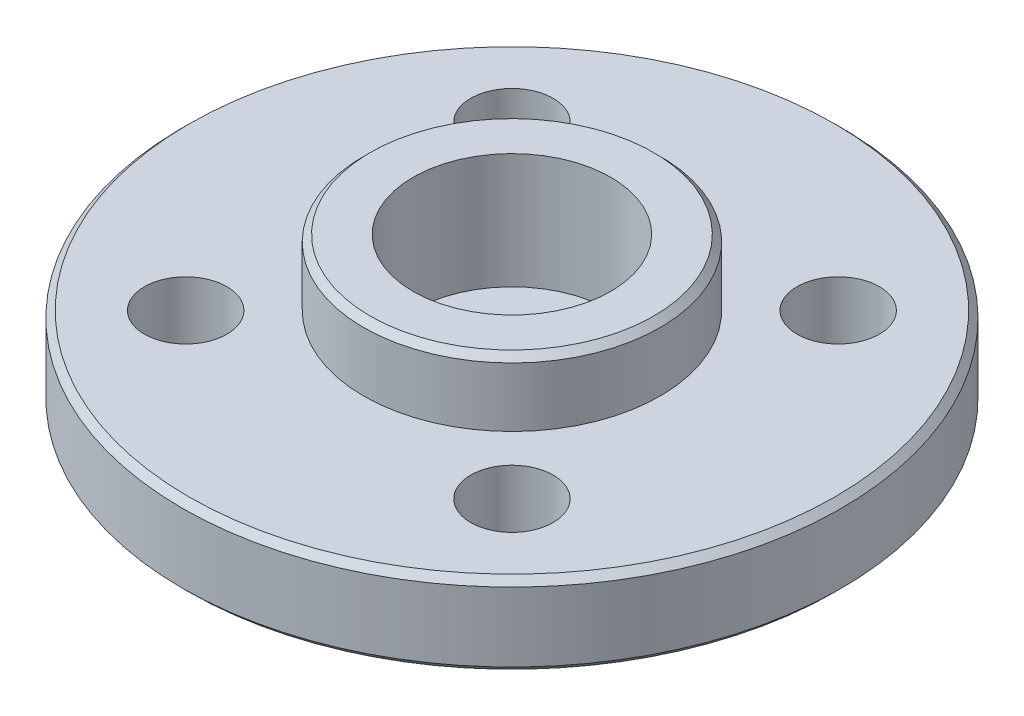
ISO-10303-21;
HEADER;
FILE_DESCRIPTION(('STEP AP214'),'2;1');
FILE_NAME('part.step','',(''),(''),'','','');
FILE_SCHEMA(('AUTOMOTIVE_DESIGN { 1 0 10303 214 1 1 1 1 }'));
ENDSEC;
DATA;
#1=APPLICATION_CONTEXT('core data for automotive mechanical design processes');
#2=APPLICATION_PROTOCOL_DEFINITION('international standard','automotive_design',2000,#1);
#3=PRODUCT_CONTEXT('',#1,'mechanical');
#4=PRODUCT('Part','Part','',(#3));
#5=PRODUCT_RELATED_PRODUCT_CATEGORY('part','',(#4));
#6=PRODUCT_DEFINITION_FORMATION('','',#4);
#7=PRODUCT_DEFINITION_CONTEXT('part definition',#1,'design');
#8=PRODUCT_DEFINITION('design','',#6,#7);
#9=PRODUCT_DEFINITION_SHAPE('','',#8);
#10=(LENGTH_UNIT() NAMED_UNIT(*) SI_UNIT(.MILLI.,.METRE.));
#11=(NAMED_UNIT(*) PLANE_ANGLE_UNIT() SI_UNIT($,.RADIAN.));
#12=(NAMED_UNIT(*) SI_UNIT($,.STERADIAN.) SOLID_ANGLE_UNIT());
#13=UNCERTAINTY_MEASURE_WITH_UNIT(LENGTH_MEASURE(1.E-05),#10,'distance_accuracy_value','');
#14=(GEOMETRIC_REPRESENTATION_CONTEXT(3) GLOBAL_UNCERTAINTY_ASSIGNED_CONTEXT((#13)) GLOBAL_UNIT_ASSIGNED_CONTEXT((#10,
#11,#12)) REPRESENTATION_CONTEXT('',''));
#15=CARTESIAN_POINT('',(0.,0.,0.));
#16=DIRECTION('',(0.,0.,1.));
#17=DIRECTION('',(1.,0.,0.));
#18=AXIS2_PLACEMENT_3D('',#15,#16,#17);
#19=CARTESIAN_POINT('',(0.,1.25,0.));
#20=DIRECTION('',(0.,-1.,0.));
#21=DIRECTION('',(0.,0.,-1.));
#22=AXIS2_PLACEMENT_3D('',#19,#20,#21);
#23=CYLINDRICAL_SURFACE('',#22,10.);
#24=CARTESIAN_POINT('',(0.,-1.04999999999999,0.));
#25=DIRECTION('',(0.,1.,0.));
#26=DIRECTION('',(0.,0.,1.));
#27=AXIS2_PLACEMENT_3D('',#24,#25,#26);
#28=CIRCLE('',#27,10.);
#29=CARTESIAN_POINT('',(0.,-1.04999999999999,10.));
#30=VERTEX_POINT('',#29);
#31=EDGE_CURVE('E68',#30,#30,#28,.T.);
#32=ORIENTED_EDGE('',*,*,#31,.T.);
#33=EDGE_LOOP('',(#32));
#34=FACE_BOUND('',#33,.T.);
#35=CARTESIAN_POINT('',(0.,1.05000000000001,0.));
#36=DIRECTION('',(0.,1.,0.));
#37=DIRECTION('',(0.,0.,1.));
#38=AXIS2_PLACEMENT_3D('',#35,#36,#37);
#39=CIRCLE('',#38,10.);
#40=CARTESIAN_POINT('',(0.,1.05000000000001,10.));
#41=VERTEX_POINT('',#40);
#42=EDGE_CURVE('E74',#41,#41,#39,.F.);
#43=ORIENTED_EDGE('',*,*,#42,.T.);
#44=EDGE_LOOP('',(#43));
#45=FACE_BOUND('',#44,.T.);
#46=ADVANCED_FACE('F44',(#34,#45),#23,.T.);
#47=CARTESIAN_POINT('',(0.,1.25,0.));
#48=DIRECTION('',(0.,1.,0.));
#49=DIRECTION('',(0.,0.,1.));
#50=AXIS2_PLACEMENT_3D('',#47,#48,#49);
#51=PLANE('',#50);
#52=CARTESIAN_POINT('',(0.,1.25,0.));
#53=DIRECTION('',(0.,1.,0.));
#54=DIRECTION('',(0.,0.,1.));
#55=AXIS2_PLACEMENT_3D('',#52,#53,#54);
#56=CIRCLE('',#55,9.80000000000001);
#57=CARTESIAN_POINT('',(0.,1.25,9.80000000000001));
#58=VERTEX_POINT('',#57);
#59=EDGE_CURVE('E56',#58,#58,#56,.T.);
#60=ORIENTED_EDGE('',*,*,#59,.T.);
#61=EDGE_LOOP('',(#60));
#62=FACE_BOUND('',#61,.T.);
#63=CARTESIAN_POINT('',(0.,1.25,0.));
#64=DIRECTION('',(0.,1.,0.));
#65=DIRECTION('',(0.,0.,1.));
#66=AXIS2_PLACEMENT_3D('',#63,#64,#65);
#67=CIRCLE('',#66,4.5);
#68=CARTESIAN_POINT('',(0.,1.25,4.5));
#69=VERTEX_POINT('',#68);
#70=EDGE_CURVE('E88',#69,#69,#67,.T.);
#71=ORIENTED_EDGE('',*,*,#70,.F.);
#72=EDGE_LOOP('',(#71));
#73=FACE_BOUND('',#72,.T.);
#74=CARTESIAN_POINT('',(4.94974746830583,1.25,-4.94974746830583));
#75=DIRECTION('',(0.,1.,0.));
#76=DIRECTION('',(0.,0.,1.));
#77=AXIS2_PLACEMENT_3D('',#74,#75,#76);
#78=CIRCLE('',#77,1.25);
#79=CARTESIAN_POINT('',(4.94974746830583,1.25,-3.69974746830583));
#80=VERTEX_POINT('',#79);
#81=EDGE_CURVE('E99',#80,#80,#78,.T.);
#82=ORIENTED_EDGE('',*,*,#81,.F.);
#83=EDGE_LOOP('',(#82));
#84=FACE_BOUND('',#83,.T.);
#85=CARTESIAN_POINT('',(4.9497474683058,1.25,4.94974746830583));
#86=DIRECTION('',(0.,1.,0.));
#87=DIRECTION('',(0.,0.,1.));
#88=AXIS2_PLACEMENT_3D('',#85,#86,#87);
#89=CIRCLE('',#88,1.25000000000003);
#90=CARTESIAN_POINT('',(4.9497474683058,1.25,6.19974746830587));
#91=VERTEX_POINT('',#90);
#92=EDGE_CURVE('E108',#91,#91,#89,.T.);
#93=ORIENTED_EDGE('',*,*,#92,.F.);
#94=EDGE_LOOP('',(#93));
#95=FACE_BOUND('',#94,.T.);
#96=CARTESIAN_POINT('',(-4.94974746830583,1.25,4.94974746830583));
#97=DIRECTION('',(0.,1.,0.));
#98=DIRECTION('',(0.,0.,1.));
#99=AXIS2_PLACEMENT_3D('',#96,#97,#98);
#100=CIRCLE('',#99,1.25);
#101=CARTESIAN_POINT('',(-4.94974746830583,1.25,6.19974746830583));
#102=VERTEX_POINT('',#101);
#103=EDGE_CURVE('E95',#102,#102,#100,.T.);
#104=ORIENTED_EDGE('',*,*,#103,.F.);
#105=EDGE_LOOP('',(#104));
#106=FACE_BOUND('',#105,.T.);
#107=CARTESIAN_POINT('',(-4.94974746830583,1.25,-4.94974746830583));
#108=DIRECTION('',(0.,1.,0.));
#109=DIRECTION('',(0.,0.,1.));
#110=AXIS2_PLACEMENT_3D('',#107,#108,#109);
#111=CIRCLE('',#110,1.25);
#112=CARTESIAN_POINT('',(-4.94974746830583,1.25,-3.69974746830583));
#113=VERTEX_POINT('',#112);
#114=EDGE_CURVE('E87',#113,#113,#111,.T.);
#115=ORIENTED_EDGE('',*,*,#114,.F.);
#116=EDGE_LOOP('',(#115));
#117=FACE_BOUND('',#116,.T.);
#118=ADVANCED_FACE('F152',(#62,#73,#84,#95,#106,#117),#51,.T.);
#119=CARTESIAN_POINT('',(0.,-1.25,0.));
#120=DIRECTION('',(0.,1.,0.));
#121=DIRECTION('',(0.,0.,1.));
#122=AXIS2_PLACEMENT_3D('',#119,#120,#121);
#123=PLANE('',#122);
#124=CARTESIAN_POINT('',(0.,-1.25,0.));
#125=DIRECTION('',(0.,1.,0.));
#126=DIRECTION('',(0.,0.,1.));
#127=AXIS2_PLACEMENT_3D('',#124,#125,#126);
#128=CIRCLE('',#127,1.7);
#129=CARTESIAN_POINT('',(0.,-1.25,1.7));
#130=VERTEX_POINT('',#129);
#131=EDGE_CURVE('E10',#130,#130,#128,.T.);
#132=ORIENTED_EDGE('',*,*,#131,.T.);
#133=EDGE_LOOP('',(#132));
#134=FACE_BOUND('',#133,.T.);
#135=CARTESIAN_POINT('',(0.,-1.25,0.));
#136=DIRECTION('',(0.,1.,0.));
#137=DIRECTION('',(0.,0.,1.));
#138=AXIS2_PLACEMENT_3D('',#135,#136,#137);
#139=CIRCLE('',#138,9.79999999999999);
#140=CARTESIAN_POINT('',(0.,-1.25,9.79999999999999));
#141=VERTEX_POINT('',#140);
#142=EDGE_CURVE('E64',#141,#141,#139,.F.);
#143=ORIENTED_EDGE('',*,*,#142,.T.);
#144=EDGE_LOOP('',(#143));
#145=FACE_BOUND('',#144,.T.);
#146=CARTESIAN_POINT('',(4.94974746830583,-1.25,-4.94974746830583));
#147=DIRECTION('',(0.,1.,0.));
#148=DIRECTION('',(0.,0.,1.));
#149=AXIS2_PLACEMENT_3D('',#146,#147,#148);
#150=CIRCLE('',#149,1.25);
#151=CARTESIAN_POINT('',(4.94974746830583,-1.25,-3.69974746830583));
#152=VERTEX_POINT('',#151);
#153=EDGE_CURVE('E96',#152,#152,#150,.T.);
#154=ORIENTED_EDGE('',*,*,#153,.T.);
#155=EDGE_LOOP('',(#154));
#156=FACE_BOUND('',#155,.T.);
#157=CARTESIAN_POINT('',(4.9497474683058,-1.25,4.94974746830583));
#158=DIRECTION('',(0.,1.,0.));
#159=DIRECTION('',(0.,0.,1.));
#160=AXIS2_PLACEMENT_3D('',#157,#158,#159);
#161=CIRCLE('',#160,1.25000000000003);
#162=CARTESIAN_POINT('',(4.9497474683058,-1.25,6.19974746830587));
#163=VERTEX_POINT('',#162);
#164=EDGE_CURVE('E104',#163,#163,#161,.T.);
#165=ORIENTED_EDGE('',*,*,#164,.T.);
#166=EDGE_LOOP('',(#165));
#167=FACE_BOUND('',#166,.T.);
#168=CARTESIAN_POINT('',(-4.94974746830583,-1.25,4.94974746830583));
#169=DIRECTION('',(0.,1.,0.));
#170=DIRECTION('',(0.,0.,1.));
#171=AXIS2_PLACEMENT_3D('',#168,#169,#170);
#172=CIRCLE('',#171,1.25);
#173=CARTESIAN_POINT('',(-4.94974746830583,-1.25,6.19974746830583));
#174=VERTEX_POINT('',#173);
#175=EDGE_CURVE('E114',#174,#174,#172,.T.);
#176=ORIENTED_EDGE('',*,*,#175,.T.);
#177=EDGE_LOOP('',(#176));
#178=FACE_BOUND('',#177,.T.);
#179=CARTESIAN_POINT('',(-4.94974746830583,-1.25,-4.94974746830583));
#180=DIRECTION('',(0.,1.,0.));
#181=DIRECTION('',(0.,0.,1.));
#182=AXIS2_PLACEMENT_3D('',#179,#180,#181);
#183=CIRCLE('',#182,1.25);
#184=CARTESIAN_POINT('',(-4.94974746830583,-1.25,-3.69974746830583));
#185=VERTEX_POINT('',#184);
#186=EDGE_CURVE('E93',#185,#185,#183,.T.);
#187=ORIENTED_EDGE('',*,*,#186,.T.);
#188=EDGE_LOOP('',(#187));
#189=FACE_BOUND('',#188,.T.);
#190=ADVANCED_FACE('F159',(#134,#145,#156,#167,#178,#189),#123,.F.);
#191=CARTESIAN_POINT('',(-4.94974746830583,-1.25,-4.94974746830583));
#192=DIRECTION('',(0.,1.,0.));
#193=DIRECTION('',(0.,0.,1.));
#194=AXIS2_PLACEMENT_3D('',#191,#192,#193);
#195=CYLINDRICAL_SURFACE('',#194,1.25);
#196=ORIENTED_EDGE('',*,*,#186,.F.);
#197=EDGE_LOOP('',(#196));
#198=FACE_BOUND('',#197,.T.);
#199=ORIENTED_EDGE('',*,*,#114,.T.);
#200=EDGE_LOOP('',(#199));
#201=FACE_BOUND('',#200,.T.);
#202=ADVANCED_FACE('F197',(#198,#201),#195,.F.);
#203=CARTESIAN_POINT('',(-4.94974746830583,-1.25,4.94974746830583));
#204=DIRECTION('',(0.,1.,0.));
#205=DIRECTION('',(0.,0.,1.));
#206=AXIS2_PLACEMENT_3D('',#203,#204,#205);
#207=CYLINDRICAL_SURFACE('',#206,1.25);
#208=ORIENTED_EDGE('',*,*,#175,.F.);
#209=EDGE_LOOP('',(#208));
#210=FACE_BOUND('',#209,.T.);
#211=ORIENTED_EDGE('',*,*,#103,.T.);
#212=EDGE_LOOP('',(#211));
#213=FACE_BOUND('',#212,.T.);
#214=ADVANCED_FACE('F200',(#210,#213),#207,.F.);
#215=CARTESIAN_POINT('',(4.9497474683058,-1.25,4.94974746830583));
#216=DIRECTION('',(0.,1.,0.));
#217=DIRECTION('',(0.,0.,1.));
#218=AXIS2_PLACEMENT_3D('',#215,#216,#217);
#219=CYLINDRICAL_SURFACE('',#218,1.25000000000003);
#220=ORIENTED_EDGE('',*,*,#164,.F.);
#221=EDGE_LOOP('',(#220));
#222=FACE_BOUND('',#221,.T.);
#223=ORIENTED_EDGE('',*,*,#92,.T.);
#224=EDGE_LOOP('',(#223));
#225=FACE_BOUND('',#224,.T.);
#226=ADVANCED_FACE('F202',(#222,#225),#219,.F.);
#227=CARTESIAN_POINT('',(4.94974746830583,-1.25,-4.94974746830583));
#228=DIRECTION('',(0.,1.,0.));
#229=DIRECTION('',(0.,0.,1.));
#230=AXIS2_PLACEMENT_3D('',#227,#228,#229);
#231=CYLINDRICAL_SURFACE('',#230,1.25);
#232=ORIENTED_EDGE('',*,*,#153,.F.);
#233=EDGE_LOOP('',(#232));
#234=FACE_BOUND('',#233,.T.);
#235=ORIENTED_EDGE('',*,*,#81,.T.);
#236=EDGE_LOOP('',(#235));
#237=FACE_BOUND('',#236,.T.);
#238=ADVANCED_FACE('F209',(#234,#237),#231,.F.);
#239=CARTESIAN_POINT('',(0.,3.25,0.));
#240=DIRECTION('',(0.,-1.,0.));
#241=DIRECTION('',(0.,0.,-1.));
#242=AXIS2_PLACEMENT_3D('',#239,#240,#241);
#243=CYLINDRICAL_SURFACE('',#242,4.5);
#244=CARTESIAN_POINT('',(0.,3.05,0.));
#245=DIRECTION('',(0.,1.,0.));
#246=DIRECTION('',(0.,0.,1.));
#247=AXIS2_PLACEMENT_3D('',#244,#245,#246);
#248=CIRCLE('',#247,4.5);
#249=CARTESIAN_POINT('',(0.,3.05,4.5));
#250=VERTEX_POINT('',#249);
#251=EDGE_CURVE('E76',#250,#250,#248,.F.);
#252=ORIENTED_EDGE('',*,*,#251,.T.);
#253=EDGE_LOOP('',(#252));
#254=FACE_BOUND('',#253,.T.);
#255=ORIENTED_EDGE('',*,*,#70,.T.);
#256=EDGE_LOOP('',(#255));
#257=FACE_BOUND('',#256,.T.);
#258=ADVANCED_FACE('F213',(#254,#257),#243,.T.);
#259=CARTESIAN_POINT('',(0.,3.25,0.));
#260=DIRECTION('',(0.,1.,0.));
#261=DIRECTION('',(0.,0.,1.));
#262=AXIS2_PLACEMENT_3D('',#259,#260,#261);
#263=PLANE('',#262);
#264=CARTESIAN_POINT('',(0.,3.25,0.));
#265=DIRECTION('',(0.,1.,0.));
#266=DIRECTION('',(0.,0.,1.));
#267=AXIS2_PLACEMENT_3D('',#264,#265,#266);
#268=CIRCLE('',#267,4.30000000000001);
#269=CARTESIAN_POINT('',(0.,3.25,4.30000000000001));
#270=VERTEX_POINT('',#269);
#271=EDGE_CURVE('E84',#270,#270,#268,.T.);
#272=ORIENTED_EDGE('',*,*,#271,.T.);
#273=EDGE_LOOP('',(#272));
#274=FACE_BOUND('',#273,.T.);
#275=CARTESIAN_POINT('',(0.,3.25,0.));
#276=DIRECTION('',(0.,1.,0.));
#277=DIRECTION('',(0.,0.,1.));
#278=AXIS2_PLACEMENT_3D('',#275,#276,#277);
#279=CIRCLE('',#278,3.);
#280=CARTESIAN_POINT('',(0.,3.25,3.));
#281=VERTEX_POINT('',#280);
#282=EDGE_CURVE('E125',#281,#281,#279,.T.);
#283=ORIENTED_EDGE('',*,*,#282,.F.);
#284=EDGE_LOOP('',(#283));
#285=FACE_BOUND('',#284,.T.);
#286=ADVANCED_FACE('F219',(#274,#285),#263,.T.);
#287=CARTESIAN_POINT('',(0.,-0.25,0.));
#288=DIRECTION('',(0.,1.,0.));
#289=DIRECTION('',(0.,0.,1.));
#290=AXIS2_PLACEMENT_3D('',#287,#288,#289);
#291=CYLINDRICAL_SURFACE('',#290,3.);
#292=CARTESIAN_POINT('',(0.,-0.25,0.));
#293=DIRECTION('',(0.,1.,0.));
#294=DIRECTION('',(0.,0.,1.));
#295=AXIS2_PLACEMENT_3D('',#292,#293,#294);
#296=CIRCLE('',#295,3.);
#297=CARTESIAN_POINT('',(0.,-0.25,3.));
#298=VERTEX_POINT('',#297);
#299=EDGE_CURVE('E101',#298,#298,#296,.T.);
#300=ORIENTED_EDGE('',*,*,#299,.F.);
#301=EDGE_LOOP('',(#300));
#302=FACE_BOUND('',#301,.T.);
#303=ORIENTED_EDGE('',*,*,#282,.T.);
#304=EDGE_LOOP('',(#303));
#305=FACE_BOUND('',#304,.T.);
#306=ADVANCED_FACE('F151',(#302,#305),#291,.F.);
#307=CARTESIAN_POINT('',(0.,-0.25,0.));
#308=DIRECTION('',(0.,1.,0.));
#309=DIRECTION('',(0.,0.,1.));
#310=AXIS2_PLACEMENT_3D('',#307,#308,#309);
#311=PLANE('',#310);
#312=CARTESIAN_POINT('',(0.,-0.25,0.));
#313=DIRECTION('',(0.,-1.,0.));
#314=DIRECTION('',(0.,0.,-1.));
#315=AXIS2_PLACEMENT_3D('',#312,#313,#314);
#316=CIRCLE('',#315,1.5);
#317=CARTESIAN_POINT('',(0.,-0.25,-1.5));
#318=VERTEX_POINT('',#317);
#319=EDGE_CURVE('E130',#318,#318,#316,.T.);
#320=ORIENTED_EDGE('',*,*,#319,.T.);
#321=EDGE_LOOP('',(#320));
#322=FACE_BOUND('',#321,.T.);
#323=ORIENTED_EDGE('',*,*,#299,.T.);
#324=EDGE_LOOP('',(#323));
#325=FACE_BOUND('',#324,.T.);
#326=ADVANCED_FACE('F132',(#322,#325),#311,.T.);
#327=CARTESIAN_POINT('',(0.,-0.25,0.));
#328=DIRECTION('',(0.,-1.,0.));
#329=DIRECTION('',(0.,0.,-1.));
#330=AXIS2_PLACEMENT_3D('',#327,#328,#329);
#331=CYLINDRICAL_SURFACE('',#330,1.5);
#332=CARTESIAN_POINT('',(0.,-1.05,0.));
#333=DIRECTION('',(0.,1.,0.));
#334=DIRECTION('',(0.,0.,1.));
#335=AXIS2_PLACEMENT_3D('',#332,#333,#334);
#336=CIRCLE('',#335,1.5);
#337=CARTESIAN_POINT('',(0.,-1.05,1.5));
#338=VERTEX_POINT('',#337);
#339=EDGE_CURVE('E53',#338,#338,#336,.F.);
#340=ORIENTED_EDGE('',*,*,#339,.T.);
#341=EDGE_LOOP('',(#340));
#342=FACE_BOUND('',#341,.T.);
#343=ORIENTED_EDGE('',*,*,#319,.F.);
#344=EDGE_LOOP('',(#343));
#345=FACE_BOUND('',#344,.T.);
#346=ADVANCED_FACE('F140',(#342,#345),#331,.F.);
#347=CARTESIAN_POINT('',(0.,3.25,0.));
#348=DIRECTION('',(0.,-1.,0.));
#349=DIRECTION('',(0.,0.,-1.));
#350=AXIS2_PLACEMENT_3D('',#347,#348,#349);
#351=CONICAL_SURFACE('',#350,4.30000000000001,0.78539816339744);
#352=ORIENTED_EDGE('',*,*,#251,.F.);
#353=EDGE_LOOP('',(#352));
#354=FACE_BOUND('',#353,.T.);
#355=ORIENTED_EDGE('',*,*,#271,.F.);
#356=EDGE_LOOP('',(#355));
#357=FACE_BOUND('',#356,.T.);
#358=ADVANCED_FACE('F138',(#354,#357),#351,.T.);
#359=CARTESIAN_POINT('',(0.,-1.04999999999999,0.));
#360=DIRECTION('',(0.,1.,0.));
#361=DIRECTION('',(0.,0.,1.));
#362=AXIS2_PLACEMENT_3D('',#359,#360,#361);
#363=CONICAL_SURFACE('',#362,10.,0.785398163397453);
#364=ORIENTED_EDGE('',*,*,#142,.F.);
#365=EDGE_LOOP('',(#364));
#366=FACE_BOUND('',#365,.T.);
#367=ORIENTED_EDGE('',*,*,#31,.F.);
#368=EDGE_LOOP('',(#367));
#369=FACE_BOUND('',#368,.T.);
#370=ADVANCED_FACE('F150',(#366,#369),#363,.T.);
#371=CARTESIAN_POINT('',(0.,1.25,0.));
#372=DIRECTION('',(0.,-1.,0.));
#373=DIRECTION('',(0.,0.,-1.));
#374=AXIS2_PLACEMENT_3D('',#371,#372,#373);
#375=CONICAL_SURFACE('',#374,9.80000000000001,0.785398163397448);
#376=ORIENTED_EDGE('',*,*,#42,.F.);
#377=EDGE_LOOP('',(#376));
#378=FACE_BOUND('',#377,.T.);
#379=ORIENTED_EDGE('',*,*,#59,.F.);
#380=EDGE_LOOP('',(#379));
#381=FACE_BOUND('',#380,.T.);
#382=ADVANCED_FACE('F174',(#378,#381),#375,.T.);
#383=CARTESIAN_POINT('',(0.,-1.05,0.));
#384=DIRECTION('',(0.,-1.,0.));
#385=DIRECTION('',(0.,0.,-1.));
#386=AXIS2_PLACEMENT_3D('',#383,#384,#385);
#387=CONICAL_SURFACE('',#386,1.5,0.785398163397453);
#388=ORIENTED_EDGE('',*,*,#131,.F.);
#389=EDGE_LOOP('',(#388));
#390=FACE_BOUND('',#389,.T.);
#391=ORIENTED_EDGE('',*,*,#339,.F.);
#392=EDGE_LOOP('',(#391));
#393=FACE_BOUND('',#392,.T.);
#394=ADVANCED_FACE('F48',(#390,#393),#387,.F.);
#395=CLOSED_SHELL('',(#46,#118,#190,#202,#214,#226,#238,#258,#286,#306,#326,#346,#358,#370,#382,#394));
#396=MANIFOLD_SOLID_BREP('B2',#395);
#397=ADVANCED_BREP_SHAPE_REPRESENTATION('',(#18,#396),#14);
#398=SHAPE_DEFINITION_REPRESENTATION(#9,#397);
ENDSEC;
END-ISO-10303-21;
